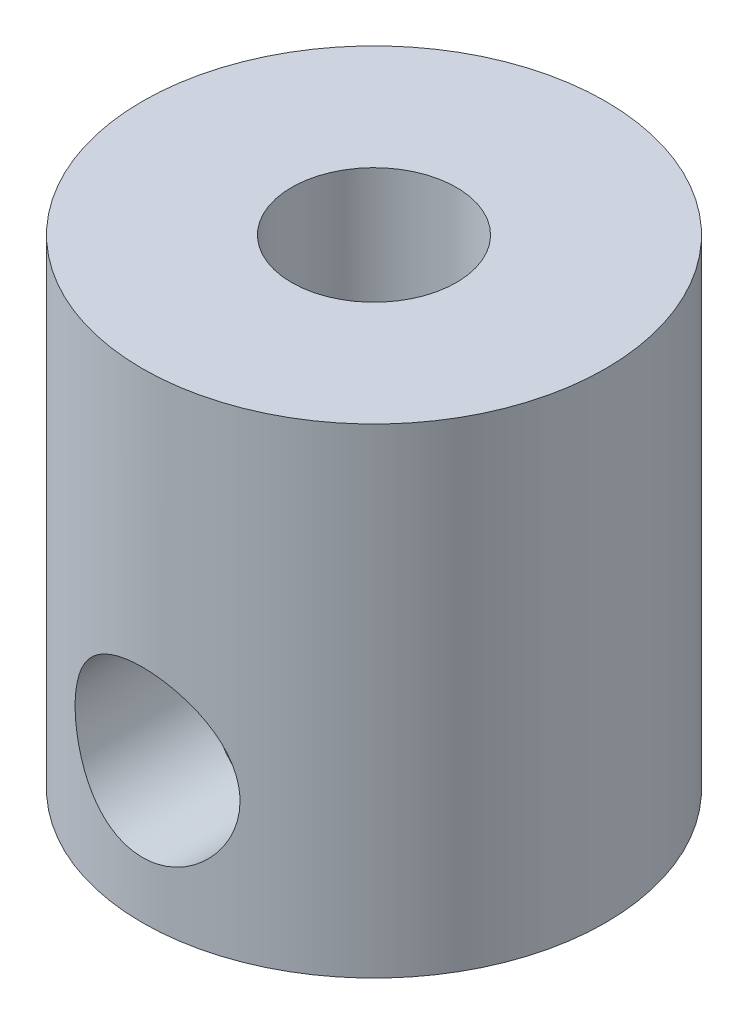
ISO-10303-21;
HEADER;
FILE_DESCRIPTION(('STEP AP214'),'2;1');
FILE_NAME('part.step','',(''),(''),'','','');
FILE_SCHEMA(('AUTOMOTIVE_DESIGN { 1 0 10303 214 1 1 1 1 }'));
ENDSEC;
DATA;
#1=APPLICATION_CONTEXT('core data for automotive mechanical design processes');
#2=APPLICATION_PROTOCOL_DEFINITION('international standard','automotive_design',2000,#1);
#3=PRODUCT_CONTEXT('',#1,'mechanical');
#4=PRODUCT('Part','Part','',(#3));
#5=PRODUCT_RELATED_PRODUCT_CATEGORY('part','',(#4));
#6=PRODUCT_DEFINITION_FORMATION('','',#4);
#7=PRODUCT_DEFINITION_CONTEXT('part definition',#1,'design');
#8=PRODUCT_DEFINITION('design','',#6,#7);
#9=PRODUCT_DEFINITION_SHAPE('','',#8);
#10=(LENGTH_UNIT() NAMED_UNIT(*) SI_UNIT(.MILLI.,.METRE.));
#11=(NAMED_UNIT(*) PLANE_ANGLE_UNIT() SI_UNIT($,.RADIAN.));
#12=(NAMED_UNIT(*) SI_UNIT($,.STERADIAN.) SOLID_ANGLE_UNIT());
#13=UNCERTAINTY_MEASURE_WITH_UNIT(LENGTH_MEASURE(1.E-05),#10,'distance_accuracy_value','');
#14=(GEOMETRIC_REPRESENTATION_CONTEXT(3) GLOBAL_UNCERTAINTY_ASSIGNED_CONTEXT((#13)) GLOBAL_UNIT_ASSIGNED_CONTEXT((#10,
#11,#12)) REPRESENTATION_CONTEXT('',''));
#15=CARTESIAN_POINT('',(0.,0.,0.));
#16=DIRECTION('',(0.,0.,1.));
#17=DIRECTION('',(1.,0.,0.));
#18=AXIS2_PLACEMENT_3D('',#15,#16,#17);
#19=CARTESIAN_POINT('',(0.,6.5786,0.));
#20=DIRECTION('',(0.,-1.,0.));
#21=DIRECTION('',(0.,0.,-1.));
#22=AXIS2_PLACEMENT_3D('',#19,#20,#21);
#23=CYLINDRICAL_SURFACE('',#22,3.175);
#24=CARTESIAN_POINT('',(1.13029999999999,1.905,2.96699290696827));
#25=CARTESIAN_POINT('',(1.1303012694956,1.84371104066149,2.96699180092178));
#26=CARTESIAN_POINT('',(1.12529831217773,1.78243087265426,2.96891266523162));
#27=CARTESIAN_POINT('',(1.10549852105485,1.6617032380783,2.976341367105));
#28=CARTESIAN_POINT('',(1.09070115134953,1.60225587197743,2.9818494009399));
#29=CARTESIAN_POINT('',(1.05191211633807,1.48696624751789,2.9957511550193));
#30=CARTESIAN_POINT('',(1.02794056093623,1.43111641398143,3.00413855954279));
#31=CARTESIAN_POINT('',(0.971553767874783,1.32421075037205,3.02284430324832));
#32=CARTESIAN_POINT('',(0.939136285381996,1.27315619974748,3.03316315558203));
#33=CARTESIAN_POINT('',(0.865225378101699,1.17500779314337,3.05508626986901));
#34=CARTESIAN_POINT('',(0.823416737479133,1.12815910938417,3.06672572194972));
#35=CARTESIAN_POINT('',(0.732580946565025,1.04196785663703,3.08968323184446));
#36=CARTESIAN_POINT('',(0.683552447130746,1.00262669370736,3.1010012291171));
#37=CARTESIAN_POINT('',(0.577839731348621,0.93141872000411,3.1224537652803));
#38=CARTESIAN_POINT('',(0.520968849300914,0.899813891197847,3.13254217002369));
#39=CARTESIAN_POINT('',(0.402295832054573,0.846719440705998,3.14997980235623));
#40=CARTESIAN_POINT('',(0.340495233260625,0.825226681767933,3.15732987935941));
#41=CARTESIAN_POINT('',(0.216291429363958,0.793812900118667,3.16821317131574));
#42=CARTESIAN_POINT('',(0.154007098319546,0.783470772189566,3.17188488321263));
#43=CARTESIAN_POINT('',(0.0284859904407205,0.773307393613326,3.1754922345549));
#44=CARTESIAN_POINT('',(-0.0347505016117884,0.77348305732183,3.17542896974461));
#45=CARTESIAN_POINT('',(-0.157380355815445,0.784094742540083,3.17166431166137));
#46=CARTESIAN_POINT('',(-0.216819232200466,0.794072221532241,3.16812551082658));
#47=CARTESIAN_POINT('',(-0.333116055100485,0.823239122974263,3.15801637664471));
#48=CARTESIAN_POINT('',(-0.389973821301093,0.842429187927704,3.15144583185916));
#49=CARTESIAN_POINT('',(-0.500434290449894,0.889714589006521,3.13581701279072));
#50=CARTESIAN_POINT('',(-0.55398035039855,0.91793071333551,3.12672523235359));
#51=CARTESIAN_POINT('',(-0.655704901634491,0.982364086244478,3.10698647045265));
#52=CARTESIAN_POINT('',(-0.70388175710461,1.01858376326905,3.09633901729824));
#53=CARTESIAN_POINT('',(-0.796215706775614,1.10025388606659,3.07392952110035));
#54=CARTESIAN_POINT('',(-0.840022503287884,1.14609295380746,3.06213831691244));
#55=CARTESIAN_POINT('',(-0.919450536225363,1.24455262127154,3.03923485845035));
#56=CARTESIAN_POINT('',(-0.95507011445571,1.29717459140461,3.02812274204891));
#57=CARTESIAN_POINT('',(-1.01769271316584,1.40895927014954,3.00766281876103));
#58=CARTESIAN_POINT('',(-1.04452651167637,1.46822387032358,2.99835093480064));
#59=CARTESIAN_POINT('',(-1.08770687791102,1.59084794602894,2.98296002370199));
#60=CARTESIAN_POINT('',(-1.10405859416821,1.65420539439739,2.97687940969726));
#61=CARTESIAN_POINT('',(-1.12505332850272,1.77978496139067,2.96900658684162));
#62=CARTESIAN_POINT('',(-1.13024679297078,1.84190238719621,2.96701300712206));
#63=CARTESIAN_POINT('',(-1.13035235934411,1.9661397141368,2.96697312971029));
#64=CARTESIAN_POINT('',(-1.12526668272105,2.02825961183634,2.96892597913741));
#65=CARTESIAN_POINT('',(-1.10545550475943,2.14806963694744,2.97635611028256));
#66=CARTESIAN_POINT('',(-1.0911347174114,2.20583689931116,2.98168526601896));
#67=CARTESIAN_POINT('',(-1.05375787852424,2.31812956528054,2.99509779472348));
#68=CARTESIAN_POINT('',(-1.03070014678854,2.37265434299103,3.00318169742524));
#69=CARTESIAN_POINT('',(-0.97559321940054,2.47902870077887,3.0215413409512));
#70=CARTESIAN_POINT('',(-0.943258091531729,2.53071831619922,3.03188377797999));
#71=CARTESIAN_POINT('',(-0.870827536052556,2.62813515891387,3.0534751542732));
#72=CARTESIAN_POINT('',(-0.830729519593911,2.67386038860491,3.06472439521551));
#73=CARTESIAN_POINT('',(-0.741245393025417,2.76070682630943,3.0876248127599));
#74=CARTESIAN_POINT('',(-0.691464443347558,2.80142589385312,3.09926313882807));
#75=CARTESIAN_POINT('',(-0.585488794794458,2.87397025379579,3.12101743586169));
#76=CARTESIAN_POINT('',(-0.529294210180939,2.90579570460364,3.13113343394065));
#77=CARTESIAN_POINT('',(-0.41225330695974,2.95939303737066,3.14867455762266));
#78=CARTESIAN_POINT('',(-0.351432796366104,2.98121652202378,3.15611345134428));
#79=CARTESIAN_POINT('',(-0.226662836118677,3.01421657077383,3.16751726579441));
#80=CARTESIAN_POINT('',(-0.162714706431157,3.02539758629355,3.17148363891749));
#81=CARTESIAN_POINT('',(-0.037158894022825,3.03635162680514,3.17537085125336));
#82=CARTESIAN_POINT('',(0.0243929105435878,3.03669853870222,3.17549520012136));
#83=CARTESIAN_POINT('',(0.146637730412363,3.02742232763043,3.1722011158763));
#84=CARTESIAN_POINT('',(0.207330832009701,3.01780021381261,3.16878304135799));
#85=CARTESIAN_POINT('',(0.324899902225856,2.98925332312023,3.1588730580352));
#86=CARTESIAN_POINT('',(0.381828226370771,2.97052049032343,3.15244466988758));
#87=CARTESIAN_POINT('',(0.491747356923694,2.92446825328885,3.13717898355161));
#88=CARTESIAN_POINT('',(0.54473742403925,2.89714724188061,3.12834123452256));
#89=CARTESIAN_POINT('',(0.647587160628668,2.83344643424889,3.10871467602532));
#90=CARTESIAN_POINT('',(0.697237489818607,2.79674861614923,3.0978620760476));
#91=CARTESIAN_POINT('',(0.789857808823595,2.71585525273557,3.07555250387425));
#92=CARTESIAN_POINT('',(0.832825512939457,2.67165715281576,3.06409532667805));
#93=CARTESIAN_POINT('',(0.912898108309833,2.57457728604716,3.04122635424545));
#94=CARTESIAN_POINT('',(0.949639270596966,2.52138813255844,3.0298412400875));
#95=CARTESIAN_POINT('',(1.01365584279661,2.40922984781982,3.00903053343651));
#96=CARTESIAN_POINT('',(1.04093198735494,2.35026116561515,2.99960478888596));
#97=CARTESIAN_POINT('',(1.08510912643681,2.22802364224738,2.9839099977344));
#98=CARTESIAN_POINT('',(1.10199264087852,2.16474775389295,2.97764627271748));
#99=CARTESIAN_POINT('',(1.12458464442987,2.03597715823261,2.96918932171509));
#100=CARTESIAN_POINT('',(1.13029864362041,1.97048356118473,2.96699408871232));
#101=CARTESIAN_POINT('',(1.13029999999999,1.905,2.96699290696827));
#102=B_SPLINE_CURVE_WITH_KNOTS('',3,(#24,#25,#26,#27,#28,#29,#30,#31,#32,#33,#34,#35,#36,#37,
#38,#39,#40,#41,#42,#43,#44,#45,#46,#47,#48,#49,#50,#51,#52,#53,#54,#55,#56,#57,#58,#59,#60,#61,
#62,#63,#64,#65,#66,#67,#68,#69,#70,#71,#72,#73,#74,#75,#76,#77,#78,#79,#80,#81,#82,#83,#84,#85,
#86,#87,#88,#89,#90,#91,#92,#93,#94,#95,#96,#97,#98,#99,#100,#101),.UNSPECIFIED.,.T.,.F.,(4,2,2,
2,2,2,2,2,2,2,2,2,2,2,2,2,2,2,2,2,2,2,2,2,2,2,2,2,2,2,2,2,2,2,2,2,2,2,4),(0.,0.183623661784849,
0.367257371351084,0.550490838429556,0.733773056690739,0.924501319590952,1.11526526836208,
1.3117975652931,1.50826884814032,1.69702812609222,1.88573202729145,2.06600906280414,
2.24629867301315,2.42910965891791,2.61197618983502,2.80457310610199,2.99720899560135,
3.19336255385326,3.38941969247876,3.57555921531924,3.76165851500697,3.94011049494311,
4.11859681030484,4.30331748902534,4.48809987675373,4.68324756844092,4.87839178402885,
5.07251754238686,5.26656206808727,5.45030949868021,5.63403833058544,5.81405386702813,
5.9941031112074,6.18133819670184,6.36863718318309,6.56461137244538,6.76057034738459,
6.95685802501447,7.15304884667681),.UNSPECIFIED.);
#103=CARTESIAN_POINT('',(1.13029999999999,1.905,2.96699290696827));
#104=VERTEX_POINT('',#103);
#105=EDGE_CURVE('E56',#104,#104,#102,.T.);
#106=ORIENTED_EDGE('',*,*,#105,.T.);
#107=EDGE_LOOP('',(#106));
#108=FACE_BOUND('',#107,.T.);
#109=CARTESIAN_POINT('',(0.,6.5786,0.));
#110=DIRECTION('',(0.,1.,0.));
#111=DIRECTION('',(0.,0.,1.));
#112=AXIS2_PLACEMENT_3D('',#109,#110,#111);
#113=CIRCLE('',#112,3.175);
#114=CARTESIAN_POINT('',(0.,6.5786,3.175));
#115=VERTEX_POINT('',#114);
#116=EDGE_CURVE('E10',#115,#115,#113,.T.);
#117=ORIENTED_EDGE('',*,*,#116,.F.);
#118=EDGE_LOOP('',(#117));
#119=FACE_BOUND('',#118,.T.);
#120=CARTESIAN_POINT('',(0.,0.,0.));
#121=DIRECTION('',(0.,1.,0.));
#122=DIRECTION('',(0.,0.,1.));
#123=AXIS2_PLACEMENT_3D('',#120,#121,#122);
#124=CIRCLE('',#123,3.175);
#125=CARTESIAN_POINT('',(0.,0.,3.175));
#126=VERTEX_POINT('',#125);
#127=EDGE_CURVE('E41',#126,#126,#124,.T.);
#128=ORIENTED_EDGE('',*,*,#127,.T.);
#129=EDGE_LOOP('',(#128));
#130=FACE_BOUND('',#129,.T.);
#131=ADVANCED_FACE('F33',(#108,#119,#130),#23,.T.);
#132=CARTESIAN_POINT('',(0.,6.5786,0.));
#133=DIRECTION('',(0.,1.,0.));
#134=DIRECTION('',(0.,0.,1.));
#135=AXIS2_PLACEMENT_3D('',#132,#133,#134);
#136=PLANE('',#135);
#137=CARTESIAN_POINT('',(0.,6.5786,0.));
#138=DIRECTION('',(0.,1.,0.));
#139=DIRECTION('',(0.,0.,1.));
#140=AXIS2_PLACEMENT_3D('',#137,#138,#139);
#141=CIRCLE('',#140,1.13029999999999);
#142=CARTESIAN_POINT('',(0.,6.5786,1.13029999999999));
#143=VERTEX_POINT('',#142);
#144=EDGE_CURVE('E53',#143,#143,#141,.T.);
#145=ORIENTED_EDGE('',*,*,#144,.F.);
#146=EDGE_LOOP('',(#145));
#147=FACE_BOUND('',#146,.T.);
#148=ORIENTED_EDGE('',*,*,#116,.T.);
#149=EDGE_LOOP('',(#148));
#150=FACE_BOUND('',#149,.T.);
#151=ADVANCED_FACE('F86',(#147,#150),#136,.T.);
#152=CARTESIAN_POINT('',(0.,0.,0.));
#153=DIRECTION('',(0.,1.,0.));
#154=DIRECTION('',(0.,0.,1.));
#155=AXIS2_PLACEMENT_3D('',#152,#153,#154);
#156=PLANE('',#155);
#157=CARTESIAN_POINT('',(0.,0.,0.));
#158=DIRECTION('',(0.,-1.,0.));
#159=DIRECTION('',(0.,0.,-1.));
#160=AXIS2_PLACEMENT_3D('',#157,#158,#159);
#161=CIRCLE('',#160,1.5875);
#162=CARTESIAN_POINT('',(0.,0.,-1.5875));
#163=VERTEX_POINT('',#162);
#164=EDGE_CURVE('E48',#163,#163,#161,.T.);
#165=ORIENTED_EDGE('',*,*,#164,.F.);
#166=EDGE_LOOP('',(#165));
#167=FACE_BOUND('',#166,.T.);
#168=ORIENTED_EDGE('',*,*,#127,.F.);
#169=EDGE_LOOP('',(#168));
#170=FACE_BOUND('',#169,.T.);
#171=ADVANCED_FACE('F84',(#167,#170),#156,.F.);
#172=CARTESIAN_POINT('',(0.,3.81,0.));
#173=DIRECTION('',(0.,-1.,0.));
#174=DIRECTION('',(0.,0.,-1.));
#175=AXIS2_PLACEMENT_3D('',#172,#173,#174);
#176=CYLINDRICAL_SURFACE('',#175,1.5875);
#177=CARTESIAN_POINT('',(1.13029999999999,1.905,1.11470989948058));
#178=CARTESIAN_POINT('',(1.13030044021676,1.95891597854669,1.11470937280683));
#179=CARTESIAN_POINT('',(1.1264064771178,2.01282975734962,1.11869903150749));
#180=CARTESIAN_POINT('',(1.11122004813074,2.11863556348447,1.13377793676846));
#181=CARTESIAN_POINT('',(1.09990973069415,2.17052239172326,1.14488431216069));
#182=CARTESIAN_POINT('',(1.07088733494003,2.27031251781493,1.17206740877004));
#183=CARTESIAN_POINT('',(1.0532510254436,2.31825503708837,1.18808499010924));
#184=CARTESIAN_POINT('',(1.01228225484479,2.41037689570693,1.22317967143603));
#185=CARTESIAN_POINT('',(0.988949899213325,2.4545563047113,1.24225671477081));
#186=CARTESIAN_POINT('',(0.932304790754718,2.5467350850536,1.2854775132616));
#187=CARTESIAN_POINT('',(0.897947364944594,2.59395707671655,1.30991008430441));
#188=CARTESIAN_POINT('',(0.82232326791722,2.68266534021681,1.35866518406819));
#189=CARTESIAN_POINT('',(0.781047561487144,2.7241439802192,1.38298752560486));
#190=CARTESIAN_POINT('',(0.684088658012499,2.80742324887683,1.43376201124872));
#191=CARTESIAN_POINT('',(0.627148218715335,2.8480099075228,1.45984198350525));
#192=CARTESIAN_POINT('',(0.50505017437417,2.91862988294265,1.50642703646415));
#193=CARTESIAN_POINT('',(0.439910101143131,2.94868521302153,1.52694372536186));
#194=CARTESIAN_POINT('',(0.322232171583228,2.98965876755663,1.55528523984861));
#195=CARTESIAN_POINT('',(0.27119621544822,3.00357127922019,1.56505117942392));
#196=CARTESIAN_POINT('',(0.16699803853397,3.02415236608885,1.57956498307944));
#197=CARTESIAN_POINT('',(0.113837586185525,3.03082684117455,1.584316934085));
#198=CARTESIAN_POINT('',(0.00678446550783865,3.03655276679325,1.58839095266725));
#199=CARTESIAN_POINT('',(-0.0471094997912201,3.03558827331912,1.58770166333123));
#200=CARTESIAN_POINT('',(-0.153878949037511,3.02605912452348,1.58093031978973));
#201=CARTESIAN_POINT('',(-0.206754155498509,3.01749242762204,1.57484681696274));
#202=CARTESIAN_POINT('',(-0.308683671574816,2.99356138138759,1.55803531105209));
#203=CARTESIAN_POINT('',(-0.357800997060336,2.9783757184654,1.54742954495984));
#204=CARTESIAN_POINT('',(-0.452670028045026,2.94194394419585,1.52238506161581));
#205=CARTESIAN_POINT('',(-0.498421050720112,2.92069660753242,1.50794556944971));
#206=CARTESIAN_POINT('',(-0.590810176501587,2.87019181965265,1.4743735480803));
#207=CARTESIAN_POINT('',(-0.63697702527409,2.8403049104914,1.45489704356622));
#208=CARTESIAN_POINT('',(-0.723908309847158,2.77477222742545,1.41365940761252));
#209=CARTESIAN_POINT('',(-0.764667132388575,2.73912055380915,1.39189594375334));
#210=CARTESIAN_POINT('',(-0.847440507511733,2.65565707592486,1.34339155966638));
#211=CARTESIAN_POINT('',(-0.888312456997405,2.60681439948108,1.3164702302305));
#212=CARTESIAN_POINT('',(-0.961593547176537,2.50247776771841,1.26393143935783));
#213=CARTESIAN_POINT('',(-0.994003432202527,2.44698439802874,1.23831386340115));
#214=CARTESIAN_POINT('',(-1.04319356694397,2.34299447638116,1.19695168655759));
#215=CARTESIAN_POINT('',(-1.06185117539786,2.29575905563295,1.18028499838973));
#216=CARTESIAN_POINT('',(-1.09287902667622,2.19794420153972,1.15161610327482));
#217=CARTESIAN_POINT('',(-1.10526094560715,2.14737117760298,1.13960524388996));
#218=CARTESIAN_POINT('',(-1.12306821069517,2.04323582797434,1.12206988533416));
#219=CARTESIAN_POINT('',(-1.12841299859151,1.9896460871016,1.11662055930786));
#220=CARTESIAN_POINT('',(-1.13134507523244,1.88204519706186,1.11365261758647));
#221=CARTESIAN_POINT('',(-1.12893741485658,1.82803434513397,1.11612883822838));
#222=CARTESIAN_POINT('',(-1.1175974920794,1.7300568501374,1.12746454930635));
#223=CARTESIAN_POINT('',(-1.10973405309598,1.68583065784802,1.13527547014486));
#224=CARTESIAN_POINT('',(-1.0891334793757,1.59948473236111,1.15505345417637));
#225=CARTESIAN_POINT('',(-1.07639071439596,1.55736749640593,1.16702531719206));
#226=CARTESIAN_POINT('',(-1.03935488636186,1.45615954968921,1.20032196806827));
#227=CARTESIAN_POINT('',(-1.01245280807502,1.39859713971256,1.22338040721257));
#228=CARTESIAN_POINT('',(-0.950157845724323,1.28958655442393,1.27237287387406));
#229=CARTESIAN_POINT('',(-0.914748019510601,1.23815088941007,1.29831258295907));
#230=CARTESIAN_POINT('',(-0.835170486125575,1.1407309088193,1.35091587231102));
#231=CARTESIAN_POINT('',(-0.790826981794416,1.09489169878335,1.37758280768804));
#232=CARTESIAN_POINT('',(-0.69435216250459,1.01083270918232,1.42863670067676));
#233=CARTESIAN_POINT('',(-0.642231873408395,0.972602318162782,1.45302680802763));
#234=CARTESIAN_POINT('',(-0.539190561487031,0.910054939286934,1.49399656894651));
#235=CARTESIAN_POINT('',(-0.489266333179163,0.884510454815652,1.51119914714193));
#236=CARTESIAN_POINT('',(-0.385000365993961,0.84079050087143,1.54105948317463));
#237=CARTESIAN_POINT('',(-0.330661191959749,0.822610789099374,1.55371985695673));
#238=CARTESIAN_POINT('',(-0.2185003819423,0.794506630300103,1.57342686828996));
#239=CARTESIAN_POINT('',(-0.160659112414512,0.78463446092902,1.58043794442416));
#240=CARTESIAN_POINT('',(-0.0437312154395101,0.774024392234937,1.58797642253516));
#241=CARTESIAN_POINT('',(0.0153547692850969,0.773281889160681,1.58850709233901));
#242=CARTESIAN_POINT('',(0.126381952074871,0.780557602145875,1.58333344332103));
#243=CARTESIAN_POINT('',(0.1784182260659,0.787658121170081,1.5782822229566));
#244=CARTESIAN_POINT('',(0.280345951774242,0.808781897830594,1.56339892406791));
#245=CARTESIAN_POINT('',(0.330237029960588,0.82280635582964,1.55356601657501));
#246=CARTESIAN_POINT('',(0.427998601992847,0.857547451374507,1.52956639229855));
#247=CARTESIAN_POINT('',(0.475785674305973,0.878424905345336,1.51529601552634));
#248=CARTESIAN_POINT('',(0.56719177950853,0.925955391887627,1.48350758461292));
#249=CARTESIAN_POINT('',(0.61081004209576,0.952609488891019,1.4659889320149));
#250=CARTESIAN_POINT('',(0.699849135299819,1.01550384652503,1.42586965574317));
#251=CARTESIAN_POINT('',(0.744506428061664,1.05258902826196,1.40290206652578));
#252=CARTESIAN_POINT('',(0.827391902768549,1.1327731601436,1.35567739734326));
#253=CARTESIAN_POINT('',(0.865607587249484,1.17588351018048,1.33141792823538));
#254=CARTESIAN_POINT('',(0.941141801534384,1.27541603443984,1.27939242798487));
#255=CARTESIAN_POINT('',(0.977204421871534,1.33285543020142,1.25173102496454));
#256=CARTESIAN_POINT('',(1.03903705566643,1.45485168673611,1.20089925736515));
#257=CARTESIAN_POINT('',(1.06482765245266,1.51939397973539,1.17771995990729));
#258=CARTESIAN_POINT('',(1.09946113615954,1.63754648788104,1.1453212957921));
#259=CARTESIAN_POINT('',(1.11093913926464,1.68980135363022,1.13405479632579));
#260=CARTESIAN_POINT('',(1.12634744095174,1.79637584711921,1.11875982328394));
#261=CARTESIAN_POINT('',(1.13029955655825,1.85068903960556,1.11471043001269));
#262=CARTESIAN_POINT('',(1.13029999999999,1.905,1.11470989948058));
#263=B_SPLINE_CURVE_WITH_KNOTS('',3,(#177,#178,#179,#180,#181,#182,#183,#184,#185,#186,#187,
#188,#189,#190,#191,#192,#193,#194,#195,#196,#197,#198,#199,#200,#201,#202,#203,#204,#205,#206,
#207,#208,#209,#210,#211,#212,#213,#214,#215,#216,#217,#218,#219,#220,#221,#222,#223,#224,#225,
#226,#227,#228,#229,#230,#231,#232,#233,#234,#235,#236,#237,#238,#239,#240,#241,#242,#243,#244,
#245,#246,#247,#248,#249,#250,#251,#252,#253,#254,#255,#256,#257,#258,#259,#260,#261,#262),
.UNSPECIFIED.,.T.,.F.,(4,2,2,2,2,2,2,2,2,2,2,2,2,2,2,2,2,2,2,2,2,2,2,2,2,2,2,2,2,2,2,2,2,2,2,2,
2,2,2,2,2,2,4),(0.,0.161489650252324,0.323369448449423,0.483371769439207,0.643371127968477,
0.832610281245817,1.02209853286085,1.24474769134181,1.46692863738566,1.62761675444026,
1.78817379244437,1.94906603226262,2.11000149294534,2.2668380874434,2.4237064076228,
2.59808869423703,2.7726505881158,2.97925208297481,3.18583539881129,3.34563925954804,
3.50514469889639,3.66646065919501,3.82767154009799,3.96390213855958,4.1002904092241,
4.30198049496654,4.50407560045261,4.71062415752859,4.91688260646501,5.09214551157744,
5.26730731669155,5.44356330708923,5.61973041449731,5.77727697334229,5.93485085470726,
6.0964240319067,6.25802700670547,6.44460948296152,6.63154988511883,6.85025615479429,
7.06852194367816,7.23166832160843,7.39434102523691),.UNSPECIFIED.);
#264=CARTESIAN_POINT('',(1.13029999999999,1.905,1.11470989948058));
#265=VERTEX_POINT('',#264);
#266=EDGE_CURVE('E62',#265,#265,#263,.T.);
#267=ORIENTED_EDGE('',*,*,#266,.T.);
#268=EDGE_LOOP('',(#267));
#269=FACE_BOUND('',#268,.T.);
#270=CARTESIAN_POINT('',(0.,3.81,0.));
#271=DIRECTION('',(0.,-1.,0.));
#272=DIRECTION('',(0.,0.,-1.));
#273=AXIS2_PLACEMENT_3D('',#270,#271,#272);
#274=CIRCLE('',#273,1.5875);
#275=CARTESIAN_POINT('',(0.,3.81,-1.5875));
#276=VERTEX_POINT('',#275);
#277=EDGE_CURVE('E46',#276,#276,#274,.T.);
#278=ORIENTED_EDGE('',*,*,#277,.F.);
#279=EDGE_LOOP('',(#278));
#280=FACE_BOUND('',#279,.T.);
#281=ORIENTED_EDGE('',*,*,#164,.T.);
#282=EDGE_LOOP('',(#281));
#283=FACE_BOUND('',#282,.T.);
#284=ADVANCED_FACE('F80',(#269,#280,#283),#176,.F.);
#285=CARTESIAN_POINT('',(0.,3.81,0.));
#286=DIRECTION('',(0.,-1.,0.));
#287=DIRECTION('',(0.,0.,-1.));
#288=AXIS2_PLACEMENT_3D('',#285,#286,#287);
#289=PLANE('',#288);
#290=CARTESIAN_POINT('',(0.,3.81,0.));
#291=DIRECTION('',(0.,-1.,0.));
#292=DIRECTION('',(0.,0.,-1.));
#293=AXIS2_PLACEMENT_3D('',#290,#291,#292);
#294=CIRCLE('',#293,1.13029999999999);
#295=CARTESIAN_POINT('',(0.,3.81,-1.13029999999999));
#296=VERTEX_POINT('',#295);
#297=EDGE_CURVE('E37',#296,#296,#294,.T.);
#298=ORIENTED_EDGE('',*,*,#297,.F.);
#299=EDGE_LOOP('',(#298));
#300=FACE_BOUND('',#299,.T.);
#301=ORIENTED_EDGE('',*,*,#277,.T.);
#302=EDGE_LOOP('',(#301));
#303=FACE_BOUND('',#302,.T.);
#304=ADVANCED_FACE('F76',(#300,#303),#289,.T.);
#305=CARTESIAN_POINT('',(0.,6.5786,0.));
#306=DIRECTION('',(0.,1.,0.));
#307=DIRECTION('',(0.,0.,1.));
#308=AXIS2_PLACEMENT_3D('',#305,#306,#307);
#309=CYLINDRICAL_SURFACE('',#308,1.13029999999999);
#310=ORIENTED_EDGE('',*,*,#297,.T.);
#311=EDGE_LOOP('',(#310));
#312=FACE_BOUND('',#311,.T.);
#313=ORIENTED_EDGE('',*,*,#144,.T.);
#314=EDGE_LOOP('',(#313));
#315=FACE_BOUND('',#314,.T.);
#316=ADVANCED_FACE('F69',(#312,#315),#309,.F.);
#317=CARTESIAN_POINT('',(0.,1.905,3.175));
#318=DIRECTION('',(0.,0.,1.));
#319=DIRECTION('',(1.,0.,0.));
#320=AXIS2_PLACEMENT_3D('',#317,#318,#319);
#321=CYLINDRICAL_SURFACE('',#320,1.13029999999999);
#322=ORIENTED_EDGE('',*,*,#266,.F.);
#323=EDGE_LOOP('',(#322));
#324=FACE_BOUND('',#323,.T.);
#325=ORIENTED_EDGE('',*,*,#105,.F.);
#326=EDGE_LOOP('',(#325));
#327=FACE_BOUND('',#326,.T.);
#328=ADVANCED_FACE('F66',(#324,#327),#321,.F.);
#329=CLOSED_SHELL('',(#131,#151,#171,#284,#304,#316,#328));
#330=MANIFOLD_SOLID_BREP('B2',#329);
#331=ADVANCED_BREP_SHAPE_REPRESENTATION('',(#18,#330),#14);
#332=SHAPE_DEFINITION_REPRESENTATION(#9,#331);
ENDSEC;
END-ISO-10303-21;
